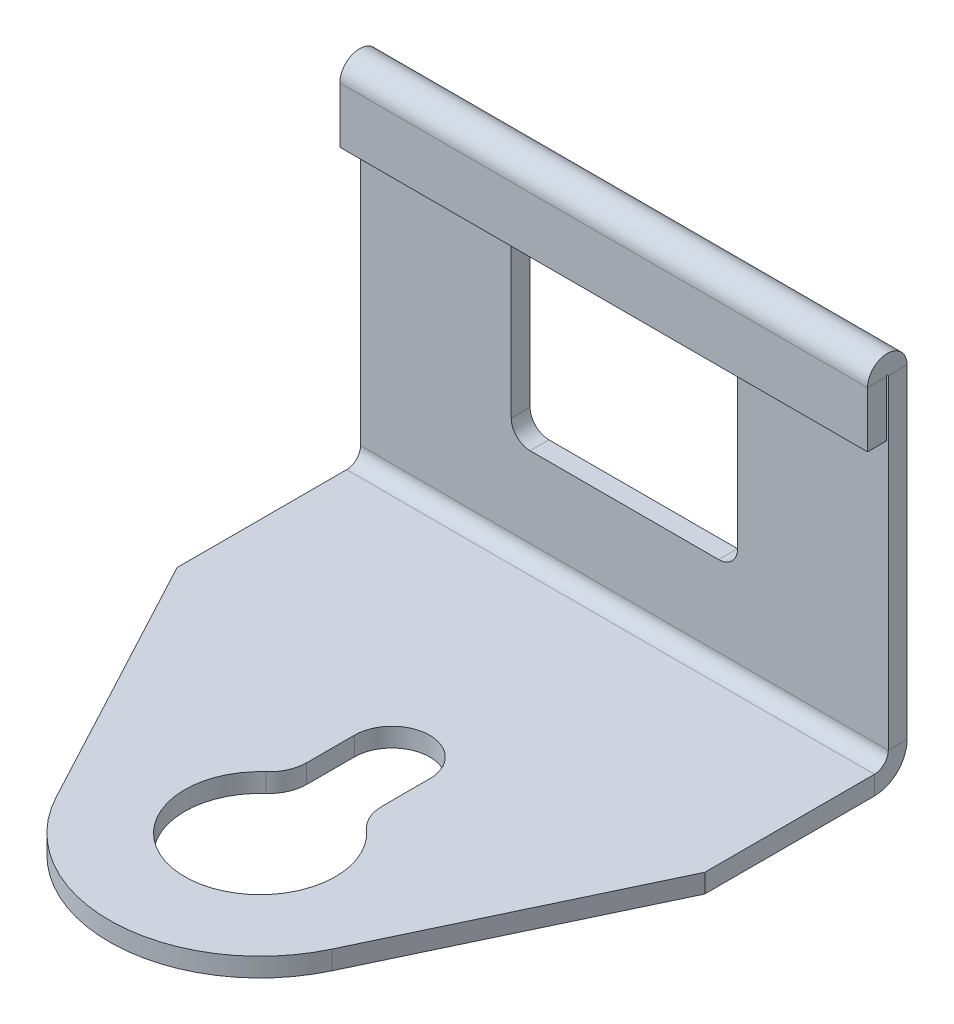
ISO-10303-21;
HEADER;
FILE_DESCRIPTION(('STEP AP214'),'2;1');
FILE_NAME('part.step','',(''),(''),'','','');
FILE_SCHEMA(('AUTOMOTIVE_DESIGN { 1 0 10303 214 1 1 1 1 }'));
ENDSEC;
DATA;
#1=APPLICATION_CONTEXT('core data for automotive mechanical design processes');
#2=APPLICATION_PROTOCOL_DEFINITION('international standard','automotive_design',2000,#1);
#3=PRODUCT_CONTEXT('',#1,'mechanical');
#4=PRODUCT('Part','Part','',(#3));
#5=PRODUCT_RELATED_PRODUCT_CATEGORY('part','',(#4));
#6=PRODUCT_DEFINITION_FORMATION('','',#4);
#7=PRODUCT_DEFINITION_CONTEXT('part definition',#1,'design');
#8=PRODUCT_DEFINITION('design','',#6,#7);
#9=PRODUCT_DEFINITION_SHAPE('','',#8);
#10=(LENGTH_UNIT() NAMED_UNIT(*) SI_UNIT(.MILLI.,.METRE.));
#11=(NAMED_UNIT(*) PLANE_ANGLE_UNIT() SI_UNIT($,.RADIAN.));
#12=(NAMED_UNIT(*) SI_UNIT($,.STERADIAN.) SOLID_ANGLE_UNIT());
#13=UNCERTAINTY_MEASURE_WITH_UNIT(LENGTH_MEASURE(1.E-05),#10,'distance_accuracy_value','');
#14=(GEOMETRIC_REPRESENTATION_CONTEXT(3) GLOBAL_UNCERTAINTY_ASSIGNED_CONTEXT((#13)) GLOBAL_UNIT_ASSIGNED_CONTEXT((#10,
#11,#12)) REPRESENTATION_CONTEXT('',''));
#15=CARTESIAN_POINT('',(0.,0.,0.));
#16=DIRECTION('',(0.,0.,1.));
#17=DIRECTION('',(1.,0.,0.));
#18=AXIS2_PLACEMENT_3D('',#15,#16,#17);
#19=CARTESIAN_POINT('',(-14.,0.,-1.7366));
#20=DIRECTION('',(-1.,0.,0.));
#21=DIRECTION('',(0.,0.,1.));
#22=AXIS2_PLACEMENT_3D('',#19,#20,#21);
#23=PLANE('',#22);
#24=DIRECTION('',(0.,1.,0.));
#25=VECTOR('',#24,1.);
#26=CARTESIAN_POINT('',(-14.,0.,-0.736599999999997));
#27=LINE('',#26,#25);
#28=CARTESIAN_POINT('',(-14.,17.95,-0.736599999999997));
#29=VERTEX_POINT('',#28);
#30=CARTESIAN_POINT('',(-14.,0.736599999999992,-0.736599999999999));
#31=VERTEX_POINT('',#30);
#32=EDGE_CURVE('E418',#29,#31,#27,.F.);
#33=ORIENTED_EDGE('',*,*,#32,.F.);
#34=DIRECTION('',(0.,0.,-1.));
#35=VECTOR('',#34,1.);
#36=CARTESIAN_POINT('',(-14.,17.95,-0.736599999999997));
#37=LINE('',#36,#35);
#38=CARTESIAN_POINT('',(-14.,17.95,-1.7366));
#39=VERTEX_POINT('',#38);
#40=EDGE_CURVE('E365',#29,#39,#37,.T.);
#41=ORIENTED_EDGE('',*,*,#40,.T.);
#42=DIRECTION('',(0.,-1.,0.));
#43=VECTOR('',#42,1.);
#44=CARTESIAN_POINT('',(-14.,0.,-1.7366));
#45=LINE('',#44,#43);
#46=CARTESIAN_POINT('',(-14.,0.736600000000004,-1.7366));
#47=VERTEX_POINT('',#46);
#48=EDGE_CURVE('E412',#39,#47,#45,.T.);
#49=ORIENTED_EDGE('',*,*,#48,.T.);
#50=DIRECTION('',(0.,0.,-1.));
#51=VECTOR('',#50,1.);
#52=CARTESIAN_POINT('',(-14.,0.736599999999997,-0.7366));
#53=LINE('',#52,#51);
#54=EDGE_CURVE('E426',#31,#47,#53,.T.);
#55=ORIENTED_EDGE('',*,*,#54,.F.);
#56=EDGE_LOOP('',(#33,#41,#49,#55));
#57=FACE_BOUND('',#56,.T.);
#58=ADVANCED_FACE('F59',(#57),#23,.T.);
#59=CARTESIAN_POINT('',(-14.,-1.,0.));
#60=DIRECTION('',(-1.,0.,0.));
#61=DIRECTION('',(0.,0.,1.));
#62=AXIS2_PLACEMENT_3D('',#59,#60,#61);
#63=PLANE('',#62);
#64=DIRECTION('',(0.,0.,1.));
#65=VECTOR('',#64,1.);
#66=CARTESIAN_POINT('',(-14.,0.,0.));
#67=LINE('',#66,#65);
#68=CARTESIAN_POINT('',(-14.,0.,0.));
#69=VERTEX_POINT('',#68);
#70=CARTESIAN_POINT('',(-14.,0.,9.));
#71=VERTEX_POINT('',#70);
#72=EDGE_CURVE('E437',#69,#71,#67,.T.);
#73=ORIENTED_EDGE('',*,*,#72,.F.);
#74=DIRECTION('',(0.,1.,0.));
#75=VECTOR('',#74,1.);
#76=CARTESIAN_POINT('',(-14.,-1.,0.));
#77=LINE('',#76,#75);
#78=CARTESIAN_POINT('',(-14.,-1.00000000000001,0.));
#79=VERTEX_POINT('',#78);
#80=EDGE_CURVE('E13',#79,#69,#77,.T.);
#81=ORIENTED_EDGE('',*,*,#80,.F.);
#82=DIRECTION('',(0.,0.,1.));
#83=VECTOR('',#82,1.);
#84=CARTESIAN_POINT('',(-14.,-1.,0.));
#85=LINE('',#84,#83);
#86=CARTESIAN_POINT('',(-14.,-1.,9.));
#87=VERTEX_POINT('',#86);
#88=EDGE_CURVE('E446',#79,#87,#85,.T.);
#89=ORIENTED_EDGE('',*,*,#88,.T.);
#90=DIRECTION('',(0.,1.,0.));
#91=VECTOR('',#90,1.);
#92=CARTESIAN_POINT('',(-14.,-1.,9.));
#93=LINE('',#92,#91);
#94=EDGE_CURVE('E63',#87,#71,#93,.T.);
#95=ORIENTED_EDGE('',*,*,#94,.T.);
#96=EDGE_LOOP('',(#73,#81,#89,#95));
#97=FACE_BOUND('',#96,.T.);
#98=ADVANCED_FACE('F61',(#97),#63,.T.);
#99=CARTESIAN_POINT('',(14.,-1.,0.));
#100=DIRECTION('',(1.,0.,0.));
#101=DIRECTION('',(0.,0.,-1.));
#102=AXIS2_PLACEMENT_3D('',#99,#100,#101);
#103=PLANE('',#102);
#104=DIRECTION('',(0.,0.,-1.));
#105=VECTOR('',#104,1.);
#106=CARTESIAN_POINT('',(14.,0.,0.));
#107=LINE('',#106,#105);
#108=CARTESIAN_POINT('',(14.,0.,9.));
#109=VERTEX_POINT('',#108);
#110=CARTESIAN_POINT('',(14.,0.,0.));
#111=VERTEX_POINT('',#110);
#112=EDGE_CURVE('E475',#109,#111,#107,.T.);
#113=ORIENTED_EDGE('',*,*,#112,.F.);
#114=DIRECTION('',(0.,1.,0.));
#115=VECTOR('',#114,1.);
#116=CARTESIAN_POINT('',(14.,-1.,9.));
#117=LINE('',#116,#115);
#118=CARTESIAN_POINT('',(14.,-1.,9.));
#119=VERTEX_POINT('',#118);
#120=EDGE_CURVE('E481',#119,#109,#117,.T.);
#121=ORIENTED_EDGE('',*,*,#120,.F.);
#122=DIRECTION('',(0.,0.,-1.));
#123=VECTOR('',#122,1.);
#124=CARTESIAN_POINT('',(14.,-1.,0.));
#125=LINE('',#124,#123);
#126=CARTESIAN_POINT('',(14.,-1.,0.));
#127=VERTEX_POINT('',#126);
#128=EDGE_CURVE('E459',#119,#127,#125,.T.);
#129=ORIENTED_EDGE('',*,*,#128,.T.);
#130=DIRECTION('',(0.,1.,0.));
#131=VECTOR('',#130,1.);
#132=CARTESIAN_POINT('',(14.,-1.,0.));
#133=LINE('',#132,#131);
#134=EDGE_CURVE('E68',#127,#111,#133,.T.);
#135=ORIENTED_EDGE('',*,*,#134,.T.);
#136=EDGE_LOOP('',(#113,#121,#129,#135));
#137=FACE_BOUND('',#136,.T.);
#138=ADVANCED_FACE('F537',(#137),#103,.T.);
#139=CARTESIAN_POINT('',(14.,-1.,9.));
#140=DIRECTION('',(0.903627273793395,0.,0.428319682079538));
#141=DIRECTION('',(0.428319682079538,0.,-0.903627273793395));
#142=AXIS2_PLACEMENT_3D('',#139,#140,#141);
#143=PLANE('',#142);
#144=DIRECTION('',(0.428319682079538,0.,-0.903627273793395));
#145=VECTOR('',#144,1.);
#146=CARTESIAN_POINT('',(14.,0.,9.));
#147=LINE('',#146,#145);
#148=CARTESIAN_POINT('',(7.63580650116148,0.,22.4265574566363));
#149=VERTEX_POINT('',#148);
#150=EDGE_CURVE('E472',#149,#109,#147,.T.);
#151=ORIENTED_EDGE('',*,*,#150,.F.);
#152=DIRECTION('',(0.,1.,0.));
#153=VECTOR('',#152,1.);
#154=CARTESIAN_POINT('',(7.63580650116148,-1.,22.4265574566363));
#155=LINE('',#154,#153);
#156=CARTESIAN_POINT('',(7.63580650116148,-1.,22.4265574566363));
#157=VERTEX_POINT('',#156);
#158=EDGE_CURVE('E483',#157,#149,#155,.T.);
#159=ORIENTED_EDGE('',*,*,#158,.F.);
#160=DIRECTION('',(0.428319682079538,0.,-0.903627273793395));
#161=VECTOR('',#160,1.);
#162=CARTESIAN_POINT('',(14.,-1.,9.));
#163=LINE('',#162,#161);
#164=EDGE_CURVE('E456',#157,#119,#163,.T.);
#165=ORIENTED_EDGE('',*,*,#164,.T.);
#166=ORIENTED_EDGE('',*,*,#120,.T.);
#167=EDGE_LOOP('',(#151,#159,#165,#166));
#168=FACE_BOUND('',#167,.T.);
#169=ADVANCED_FACE('F540',(#168),#143,.T.);
#170=CARTESIAN_POINT('',(0.406788310814313,-1.,19.));
#171=DIRECTION('',(0.,1.,0.));
#172=DIRECTION('',(0.,0.,1.));
#173=AXIS2_PLACEMENT_3D('',#170,#171,#172);
#174=CYLINDRICAL_SURFACE('',#173,8.);
#175=CARTESIAN_POINT('',(0.406788310814313,0.,19.));
#176=DIRECTION('',(0.,1.,0.));
#177=DIRECTION('',(0.,0.,1.));
#178=AXIS2_PLACEMENT_3D('',#175,#176,#177);
#179=CIRCLE('',#178,8.);
#180=CARTESIAN_POINT('',(-6.65058966208493,0.,22.7674150484963));
#181=VERTEX_POINT('',#180);
#182=EDGE_CURVE('E469',#181,#149,#179,.T.);
#183=ORIENTED_EDGE('',*,*,#182,.F.);
#184=DIRECTION('',(0.,1.,0.));
#185=VECTOR('',#184,1.);
#186=CARTESIAN_POINT('',(-6.65058966208493,-1.,22.7674150484963));
#187=LINE('',#186,#185);
#188=CARTESIAN_POINT('',(-6.65058966208493,-1.,22.7674150484963));
#189=VERTEX_POINT('',#188);
#190=EDGE_CURVE('E484',#189,#181,#187,.T.);
#191=ORIENTED_EDGE('',*,*,#190,.F.);
#192=CARTESIAN_POINT('',(0.406788310814313,-1.,19.));
#193=DIRECTION('',(0.,1.,0.));
#194=DIRECTION('',(0.,0.,1.));
#195=AXIS2_PLACEMENT_3D('',#192,#193,#194);
#196=CIRCLE('',#195,8.);
#197=EDGE_CURVE('E453',#189,#157,#196,.T.);
#198=ORIENTED_EDGE('',*,*,#197,.T.);
#199=ORIENTED_EDGE('',*,*,#158,.T.);
#200=EDGE_LOOP('',(#183,#191,#198,#199));
#201=FACE_BOUND('',#200,.T.);
#202=ADVANCED_FACE('F543',(#201),#174,.T.);
#203=CARTESIAN_POINT('',(-14.,-1.,9.));
#204=DIRECTION('',(-0.882172246612405,0.,0.470926881062041));
#205=DIRECTION('',(0.470926881062041,0.,0.882172246612406));
#206=AXIS2_PLACEMENT_3D('',#203,#204,#205);
#207=PLANE('',#206);
#208=DIRECTION('',(0.470926881062041,0.,0.882172246612405));
#209=VECTOR('',#208,1.);
#210=CARTESIAN_POINT('',(-14.,0.,9.));
#211=LINE('',#210,#209);
#212=EDGE_CURVE('E466',#71,#181,#211,.T.);
#213=ORIENTED_EDGE('',*,*,#212,.F.);
#214=ORIENTED_EDGE('',*,*,#94,.F.);
#215=DIRECTION('',(0.470926881062041,0.,0.882172246612405));
#216=VECTOR('',#215,1.);
#217=CARTESIAN_POINT('',(-14.,-1.,9.));
#218=LINE('',#217,#216);
#219=EDGE_CURVE('E449',#87,#189,#218,.T.);
#220=ORIENTED_EDGE('',*,*,#219,.T.);
#221=ORIENTED_EDGE('',*,*,#190,.T.);
#222=EDGE_LOOP('',(#213,#214,#220,#221));
#223=FACE_BOUND('',#222,.T.);
#224=ADVANCED_FACE('F491',(#223),#207,.T.);
#225=CARTESIAN_POINT('',(0.406788310814313,-1.,19.));
#226=DIRECTION('',(0.,1.,0.));
#227=DIRECTION('',(0.,0.,1.));
#228=AXIS2_PLACEMENT_3D('',#225,#226,#227);
#229=PLANE('',#228);
#230=CARTESIAN_POINT('',(0.406788310814313,-0.999999999999999,19.));
#231=DIRECTION('',(0.,1.,0.));
#232=DIRECTION('',(0.,0.,1.));
#233=AXIS2_PLACEMENT_3D('',#230,#231,#232);
#234=CIRCLE('',#233,4.);
#235=CARTESIAN_POINT('',(-2.25987835585235,-0.999999999999999,16.0185760300003));
#236=VERTEX_POINT('',#235);
#237=CARTESIAN_POINT('',(3.07345497748098,-0.999999999999999,16.0185760300003));
#238=VERTEX_POINT('',#237);
#239=EDGE_CURVE('E294',#236,#238,#234,.T.);
#240=ORIENTED_EDGE('',*,*,#239,.T.);
#241=CARTESIAN_POINT('',(4.40678831081431,-0.999999999999999,14.5278640450004));
#242=DIRECTION('',(0.,1.,0.));
#243=DIRECTION('',(0.,0.,1.));
#244=AXIS2_PLACEMENT_3D('',#241,#242,#243);
#245=CIRCLE('',#244,2.);
#246=CARTESIAN_POINT('',(2.40678831081431,-0.999999999999999,14.5278640450004));
#247=VERTEX_POINT('',#246);
#248=EDGE_CURVE('E297',#238,#247,#245,.F.);
#249=ORIENTED_EDGE('',*,*,#248,.T.);
#250=DIRECTION('',(0.,0.,-1.));
#251=VECTOR('',#250,1.);
#252=CARTESIAN_POINT('',(2.40678831081431,-1.,19.));
#253=LINE('',#252,#251);
#254=CARTESIAN_POINT('',(2.40678831081431,-1.,12.));
#255=VERTEX_POINT('',#254);
#256=EDGE_CURVE('E279',#247,#255,#253,.T.);
#257=ORIENTED_EDGE('',*,*,#256,.T.);
#258=CARTESIAN_POINT('',(0.406788310814314,-0.999999999999999,12.));
#259=DIRECTION('',(0.,1.,0.));
#260=DIRECTION('',(0.,0.,1.));
#261=AXIS2_PLACEMENT_3D('',#258,#259,#260);
#262=CIRCLE('',#261,2.);
#263=CARTESIAN_POINT('',(-1.59321168918569,-0.999999999999999,12.));
#264=VERTEX_POINT('',#263);
#265=EDGE_CURVE('E252',#255,#264,#262,.T.);
#266=ORIENTED_EDGE('',*,*,#265,.T.);
#267=DIRECTION('',(0.,0.,1.));
#268=VECTOR('',#267,1.);
#269=CARTESIAN_POINT('',(-1.59321168918569,-1.,19.));
#270=LINE('',#269,#268);
#271=CARTESIAN_POINT('',(-1.59321168918569,-0.999999999999999,14.5278640450004));
#272=VERTEX_POINT('',#271);
#273=EDGE_CURVE('E288',#264,#272,#270,.T.);
#274=ORIENTED_EDGE('',*,*,#273,.T.);
#275=CARTESIAN_POINT('',(-3.59321168918569,-0.999999999999999,14.5278640450004));
#276=DIRECTION('',(0.,1.,0.));
#277=DIRECTION('',(0.,0.,1.));
#278=AXIS2_PLACEMENT_3D('',#275,#276,#277);
#279=CIRCLE('',#278,2.);
#280=EDGE_CURVE('E291',#272,#236,#279,.F.);
#281=ORIENTED_EDGE('',*,*,#280,.T.);
#282=EDGE_LOOP('',(#240,#249,#257,#266,#274,#281));
#283=FACE_BOUND('',#282,.T.);
#284=ORIENTED_EDGE('',*,*,#88,.F.);
#285=DIRECTION('',(-1.,0.,0.));
#286=VECTOR('',#285,1.);
#287=CARTESIAN_POINT('',(-14.,-1.,0.));
#288=LINE('',#287,#286);
#289=EDGE_CURVE('E461',#127,#79,#288,.T.);
#290=ORIENTED_EDGE('',*,*,#289,.F.);
#291=ORIENTED_EDGE('',*,*,#128,.F.);
#292=ORIENTED_EDGE('',*,*,#164,.F.);
#293=ORIENTED_EDGE('',*,*,#197,.F.);
#294=ORIENTED_EDGE('',*,*,#219,.F.);
#295=EDGE_LOOP('',(#284,#290,#291,#292,#293,#294));
#296=FACE_BOUND('',#295,.T.);
#297=ADVANCED_FACE('F532',(#283,#296),#229,.F.);
#298=CARTESIAN_POINT('',(0.406788310814313,0.,19.));
#299=DIRECTION('',(0.,1.,0.));
#300=DIRECTION('',(0.,0.,1.));
#301=AXIS2_PLACEMENT_3D('',#298,#299,#300);
#302=PLANE('',#301);
#303=CARTESIAN_POINT('',(4.40678831081431,0.,14.5278640450004));
#304=DIRECTION('',(0.,-1.,0.));
#305=DIRECTION('',(0.,0.,1.));
#306=AXIS2_PLACEMENT_3D('',#303,#304,#305);
#307=CIRCLE('',#306,2.);
#308=CARTESIAN_POINT('',(3.07345497748098,0.,16.0185760300003));
#309=VERTEX_POINT('',#308);
#310=CARTESIAN_POINT('',(2.40678831081431,0.,14.5278640450004));
#311=VERTEX_POINT('',#310);
#312=EDGE_CURVE('E84',#309,#311,#307,.T.);
#313=ORIENTED_EDGE('',*,*,#312,.F.);
#314=CARTESIAN_POINT('',(0.406788310814313,0.,19.));
#315=DIRECTION('',(0.,1.,0.));
#316=DIRECTION('',(0.,0.,1.));
#317=AXIS2_PLACEMENT_3D('',#314,#315,#316);
#318=CIRCLE('',#317,4.);
#319=CARTESIAN_POINT('',(-2.25987835585235,0.,16.0185760300003));
#320=VERTEX_POINT('',#319);
#321=EDGE_CURVE('E274',#320,#309,#318,.T.);
#322=ORIENTED_EDGE('',*,*,#321,.F.);
#323=CARTESIAN_POINT('',(-3.59321168918569,0.,14.5278640450004));
#324=DIRECTION('',(0.,-1.,0.));
#325=DIRECTION('',(0.,0.,-1.));
#326=AXIS2_PLACEMENT_3D('',#323,#324,#325);
#327=CIRCLE('',#326,2.);
#328=CARTESIAN_POINT('',(-1.59321168918569,0.,14.5278640450004));
#329=VERTEX_POINT('',#328);
#330=EDGE_CURVE('E268',#329,#320,#327,.T.);
#331=ORIENTED_EDGE('',*,*,#330,.F.);
#332=DIRECTION('',(0.,0.,1.));
#333=VECTOR('',#332,1.);
#334=CARTESIAN_POINT('',(-1.59321168918569,0.,12.));
#335=LINE('',#334,#333);
#336=CARTESIAN_POINT('',(-1.59321168918569,0.,12.));
#337=VERTEX_POINT('',#336);
#338=EDGE_CURVE('E266',#337,#329,#335,.T.);
#339=ORIENTED_EDGE('',*,*,#338,.F.);
#340=CARTESIAN_POINT('',(0.406788310814314,0.,12.));
#341=DIRECTION('',(0.,1.,0.));
#342=DIRECTION('',(0.,0.,1.));
#343=AXIS2_PLACEMENT_3D('',#340,#341,#342);
#344=CIRCLE('',#343,2.);
#345=CARTESIAN_POINT('',(2.40678831081431,0.,12.));
#346=VERTEX_POINT('',#345);
#347=EDGE_CURVE('E249',#346,#337,#344,.T.);
#348=ORIENTED_EDGE('',*,*,#347,.F.);
#349=DIRECTION('',(0.,0.,-1.));
#350=VECTOR('',#349,1.);
#351=CARTESIAN_POINT('',(2.40678831081431,0.,12.));
#352=LINE('',#351,#350);
#353=EDGE_CURVE('E258',#311,#346,#352,.T.);
#354=ORIENTED_EDGE('',*,*,#353,.F.);
#355=EDGE_LOOP('',(#313,#322,#331,#339,#348,#354));
#356=FACE_BOUND('',#355,.T.);
#357=ORIENTED_EDGE('',*,*,#72,.T.);
#358=ORIENTED_EDGE('',*,*,#212,.T.);
#359=ORIENTED_EDGE('',*,*,#182,.T.);
#360=ORIENTED_EDGE('',*,*,#150,.T.);
#361=ORIENTED_EDGE('',*,*,#112,.T.);
#362=DIRECTION('',(-1.,0.,0.));
#363=VECTOR('',#362,1.);
#364=CARTESIAN_POINT('',(-14.,0.,0.));
#365=LINE('',#364,#363);
#366=EDGE_CURVE('E450',#111,#69,#365,.T.);
#367=ORIENTED_EDGE('',*,*,#366,.T.);
#368=EDGE_LOOP('',(#357,#358,#359,#360,#361,#367));
#369=FACE_BOUND('',#368,.T.);
#370=ADVANCED_FACE('F262',(#356,#369),#302,.T.);
#371=CARTESIAN_POINT('',(14.,0.736599999999992,0.));
#372=DIRECTION('',(1.,0.,0.));
#373=DIRECTION('',(0.,0.,-1.));
#374=AXIS2_PLACEMENT_3D('',#371,#372,#373);
#375=PLANE('',#374);
#376=DIRECTION('',(0.,0.,-1.));
#377=VECTOR('',#376,1.);
#378=CARTESIAN_POINT('',(14.,0.736600000000004,-1.73660000000012));
#379=LINE('',#378,#377);
#380=CARTESIAN_POINT('',(14.,0.736599999999992,-0.736599999999997));
#381=VERTEX_POINT('',#380);
#382=CARTESIAN_POINT('',(14.,0.736599999999992,-1.7366));
#383=VERTEX_POINT('',#382);
#384=EDGE_CURVE('E410',#381,#383,#379,.T.);
#385=ORIENTED_EDGE('',*,*,#384,.F.);
#386=CARTESIAN_POINT('',(14.,0.736599999999992,0.));
#387=DIRECTION('',(-1.,0.,0.));
#388=DIRECTION('',(0.,0.,1.));
#389=AXIS2_PLACEMENT_3D('',#386,#387,#388);
#390=CIRCLE('',#389,0.736599999999998);
#391=EDGE_CURVE('E441',#111,#381,#390,.F.);
#392=ORIENTED_EDGE('',*,*,#391,.F.);
#393=ORIENTED_EDGE('',*,*,#134,.F.);
#394=CARTESIAN_POINT('',(14.,0.736599999999992,0.));
#395=DIRECTION('',(-1.,0.,0.));
#396=DIRECTION('',(0.,0.,1.));
#397=AXIS2_PLACEMENT_3D('',#394,#395,#396);
#398=CIRCLE('',#397,1.7366);
#399=EDGE_CURVE('E434',#127,#383,#398,.F.);
#400=ORIENTED_EDGE('',*,*,#399,.T.);
#401=EDGE_LOOP('',(#385,#392,#393,#400));
#402=FACE_BOUND('',#401,.T.);
#403=ADVANCED_FACE('F535',(#402),#375,.T.);
#404=CARTESIAN_POINT('',(-14.,0.736599999999992,0.));
#405=DIRECTION('',(1.,0.,0.));
#406=DIRECTION('',(0.,0.,-1.));
#407=AXIS2_PLACEMENT_3D('',#404,#405,#406);
#408=PLANE('',#407);
#409=CARTESIAN_POINT('',(-14.,0.736599999999992,0.));
#410=DIRECTION('',(-1.,0.,0.));
#411=DIRECTION('',(0.,0.,1.));
#412=AXIS2_PLACEMENT_3D('',#409,#410,#411);
#413=CIRCLE('',#412,0.736599999999998);
#414=EDGE_CURVE('E414',#31,#69,#413,.T.);
#415=ORIENTED_EDGE('',*,*,#414,.F.);
#416=ORIENTED_EDGE('',*,*,#54,.T.);
#417=CARTESIAN_POINT('',(-14.,0.736599999999992,0.));
#418=DIRECTION('',(-1.,0.,0.));
#419=DIRECTION('',(0.,0.,1.));
#420=AXIS2_PLACEMENT_3D('',#417,#418,#419);
#421=CIRCLE('',#420,1.7366);
#422=EDGE_CURVE('E438',#47,#79,#421,.T.);
#423=ORIENTED_EDGE('',*,*,#422,.T.);
#424=ORIENTED_EDGE('',*,*,#80,.T.);
#425=EDGE_LOOP('',(#415,#416,#423,#424));
#426=FACE_BOUND('',#425,.T.);
#427=ADVANCED_FACE('F498',(#426),#408,.F.);
#428=CARTESIAN_POINT('',(-14.,0.736599999999992,0.));
#429=DIRECTION('',(-1.,0.,0.));
#430=DIRECTION('',(0.,0.,-1.));
#431=AXIS2_PLACEMENT_3D('',#428,#429,#430);
#432=CYLINDRICAL_SURFACE('',#431,1.7366);
#433=ORIENTED_EDGE('',*,*,#289,.T.);
#434=ORIENTED_EDGE('',*,*,#422,.F.);
#435=DIRECTION('',(-1.,0.,0.));
#436=VECTOR('',#435,1.);
#437=CARTESIAN_POINT('',(0.,0.736600000000004,-1.7366));
#438=LINE('',#437,#436);
#439=EDGE_CURVE('E423',#383,#47,#438,.T.);
#440=ORIENTED_EDGE('',*,*,#439,.F.);
#441=ORIENTED_EDGE('',*,*,#399,.F.);
#442=EDGE_LOOP('',(#433,#434,#440,#441));
#443=FACE_BOUND('',#442,.T.);
#444=ADVANCED_FACE('F526',(#443),#432,.T.);
#445=CARTESIAN_POINT('',(-14.,0.736599999999992,0.));
#446=DIRECTION('',(-1.,0.,0.));
#447=DIRECTION('',(0.,0.,-1.));
#448=AXIS2_PLACEMENT_3D('',#445,#446,#447);
#449=CYLINDRICAL_SURFACE('',#448,0.736599999999998);
#450=ORIENTED_EDGE('',*,*,#366,.F.);
#451=ORIENTED_EDGE('',*,*,#391,.T.);
#452=DIRECTION('',(1.,0.,0.));
#453=VECTOR('',#452,1.);
#454=CARTESIAN_POINT('',(14.,0.736599999999997,-0.736599999999997));
#455=LINE('',#454,#453);
#456=EDGE_CURVE('E429',#381,#31,#455,.F.);
#457=ORIENTED_EDGE('',*,*,#456,.T.);
#458=ORIENTED_EDGE('',*,*,#414,.T.);
#459=EDGE_LOOP('',(#450,#451,#457,#458));
#460=FACE_BOUND('',#459,.T.);
#461=ADVANCED_FACE('F501',(#460),#449,.F.);
#462=CARTESIAN_POINT('',(14.,19.,-1.7366));
#463=DIRECTION('',(1.,0.,0.));
#464=DIRECTION('',(0.,0.,-1.));
#465=AXIS2_PLACEMENT_3D('',#462,#463,#464);
#466=PLANE('',#465);
#467=DIRECTION('',(0.,0.,-1.));
#468=VECTOR('',#467,1.);
#469=CARTESIAN_POINT('',(14.,17.95,-0.736599999999997));
#470=LINE('',#469,#468);
#471=CARTESIAN_POINT('',(14.,17.95,-0.736599999999997));
#472=VERTEX_POINT('',#471);
#473=CARTESIAN_POINT('',(14.,17.95,-1.7366));
#474=VERTEX_POINT('',#473);
#475=EDGE_CURVE('E374',#472,#474,#470,.T.);
#476=ORIENTED_EDGE('',*,*,#475,.F.);
#477=DIRECTION('',(0.,-1.,0.));
#478=VECTOR('',#477,1.);
#479=CARTESIAN_POINT('',(14.,0.,-0.736599999999997));
#480=LINE('',#479,#478);
#481=EDGE_CURVE('E420',#381,#472,#480,.F.);
#482=ORIENTED_EDGE('',*,*,#481,.F.);
#483=ORIENTED_EDGE('',*,*,#384,.T.);
#484=DIRECTION('',(0.,1.,0.));
#485=VECTOR('',#484,1.);
#486=CARTESIAN_POINT('',(14.,19.,-1.7366));
#487=LINE('',#486,#485);
#488=EDGE_CURVE('E415',#383,#474,#487,.T.);
#489=ORIENTED_EDGE('',*,*,#488,.T.);
#490=EDGE_LOOP('',(#476,#482,#483,#489));
#491=FACE_BOUND('',#490,.T.);
#492=ADVANCED_FACE('F510',(#491),#466,.T.);
#493=CARTESIAN_POINT('',(0.,0.,-1.7366));
#494=DIRECTION('',(0.,0.,-1.));
#495=DIRECTION('',(-1.,0.,0.));
#496=AXIS2_PLACEMENT_3D('',#493,#494,#495);
#497=PLANE('',#496);
#498=CARTESIAN_POINT('',(5.00409033535975,6.,-1.7366));
#499=DIRECTION('',(0.,0.,-1.));
#500=DIRECTION('',(-1.,0.,0.));
#501=AXIS2_PLACEMENT_3D('',#498,#499,#500);
#502=CIRCLE('',#501,0.999999999999997);
#503=CARTESIAN_POINT('',(6.00409033535975,6.,-1.7366));
#504=VERTEX_POINT('',#503);
#505=CARTESIAN_POINT('',(5.00409033535975,5.00000000000001,-1.7366));
#506=VERTEX_POINT('',#505);
#507=EDGE_CURVE('E355',#504,#506,#502,.T.);
#508=ORIENTED_EDGE('',*,*,#507,.F.);
#509=DIRECTION('',(0.,-1.,0.));
#510=VECTOR('',#509,1.);
#511=CARTESIAN_POINT('',(6.00409033535975,0.,-1.7366));
#512=LINE('',#511,#510);
#513=CARTESIAN_POINT('',(6.00409033535975,14.0571176454546,-1.7366));
#514=VERTEX_POINT('',#513);
#515=EDGE_CURVE('E326',#514,#504,#512,.T.);
#516=ORIENTED_EDGE('',*,*,#515,.F.);
#517=CARTESIAN_POINT('',(5.00409033535975,14.0571176454546,-1.7366));
#518=DIRECTION('',(0.,0.,-1.));
#519=DIRECTION('',(-1.,0.,0.));
#520=AXIS2_PLACEMENT_3D('',#517,#518,#519);
#521=CIRCLE('',#520,0.999999999999999);
#522=CARTESIAN_POINT('',(5.00409033535975,15.0571176454546,-1.7366));
#523=VERTEX_POINT('',#522);
#524=EDGE_CURVE('E342',#523,#514,#521,.T.);
#525=ORIENTED_EDGE('',*,*,#524,.F.);
#526=DIRECTION('',(1.,0.,0.));
#527=VECTOR('',#526,1.);
#528=CARTESIAN_POINT('',(0.,15.0571176454546,-1.7366));
#529=LINE('',#528,#527);
#530=CARTESIAN_POINT('',(-5.00409033535975,15.0571176454546,-1.7366));
#531=VERTEX_POINT('',#530);
#532=EDGE_CURVE('E345',#531,#523,#529,.T.);
#533=ORIENTED_EDGE('',*,*,#532,.F.);
#534=CARTESIAN_POINT('',(-5.00409033535975,14.0571176454546,-1.7366));
#535=DIRECTION('',(0.,0.,-1.));
#536=DIRECTION('',(-1.,0.,0.));
#537=AXIS2_PLACEMENT_3D('',#534,#535,#536);
#538=CIRCLE('',#537,1.);
#539=CARTESIAN_POINT('',(-6.00409033535975,14.0571176454546,-1.7366));
#540=VERTEX_POINT('',#539);
#541=EDGE_CURVE('E347',#540,#531,#538,.T.);
#542=ORIENTED_EDGE('',*,*,#541,.F.);
#543=DIRECTION('',(0.,1.,0.));
#544=VECTOR('',#543,1.);
#545=CARTESIAN_POINT('',(-6.00409033535975,0.,-1.7366));
#546=LINE('',#545,#544);
#547=CARTESIAN_POINT('',(-6.00409033535975,6.,-1.7366));
#548=VERTEX_POINT('',#547);
#549=EDGE_CURVE('E349',#548,#540,#546,.T.);
#550=ORIENTED_EDGE('',*,*,#549,.F.);
#551=CARTESIAN_POINT('',(-5.00409033535975,6.,-1.7366));
#552=DIRECTION('',(0.,0.,-1.));
#553=DIRECTION('',(-1.,0.,0.));
#554=AXIS2_PLACEMENT_3D('',#551,#552,#553);
#555=CIRCLE('',#554,1.);
#556=CARTESIAN_POINT('',(-5.00409033535975,5.,-1.7366));
#557=VERTEX_POINT('',#556);
#558=EDGE_CURVE('E351',#557,#548,#555,.T.);
#559=ORIENTED_EDGE('',*,*,#558,.F.);
#560=DIRECTION('',(-1.,0.,0.));
#561=VECTOR('',#560,1.);
#562=CARTESIAN_POINT('',(0.,5.,-1.7366));
#563=LINE('',#562,#561);
#564=EDGE_CURVE('E353',#506,#557,#563,.T.);
#565=ORIENTED_EDGE('',*,*,#564,.F.);
#566=EDGE_LOOP('',(#508,#516,#525,#533,#542,#550,#559,#565));
#567=FACE_BOUND('',#566,.T.);
#568=DIRECTION('',(-1.,0.,0.));
#569=VECTOR('',#568,1.);
#570=CARTESIAN_POINT('',(-14.,17.95,-1.7366));
#571=LINE('',#570,#569);
#572=EDGE_CURVE('E358',#39,#474,#571,.F.);
#573=ORIENTED_EDGE('',*,*,#572,.T.);
#574=ORIENTED_EDGE('',*,*,#488,.F.);
#575=ORIENTED_EDGE('',*,*,#439,.T.);
#576=ORIENTED_EDGE('',*,*,#48,.F.);
#577=EDGE_LOOP('',(#573,#574,#575,#576));
#578=FACE_BOUND('',#577,.T.);
#579=ADVANCED_FACE('F522',(#567,#578),#497,.T.);
#580=CARTESIAN_POINT('',(0.,0.,-0.736599999999997));
#581=DIRECTION('',(0.,0.,-1.));
#582=DIRECTION('',(-1.,0.,0.));
#583=AXIS2_PLACEMENT_3D('',#580,#581,#582);
#584=PLANE('',#583);
#585=DIRECTION('',(0.,1.,0.));
#586=VECTOR('',#585,1.);
#587=CARTESIAN_POINT('',(6.00409033535975,14.0571176454546,-0.736599999999997));
#588=LINE('',#587,#586);
#589=CARTESIAN_POINT('',(6.00409033535975,6.,-0.736599999999997));
#590=VERTEX_POINT('',#589);
#591=CARTESIAN_POINT('',(6.00409033535975,14.0571176454546,-0.736599999999997));
#592=VERTEX_POINT('',#591);
#593=EDGE_CURVE('E302',#590,#592,#588,.T.);
#594=ORIENTED_EDGE('',*,*,#593,.F.);
#595=CARTESIAN_POINT('',(5.00409033535975,6.,-0.736599999999997));
#596=DIRECTION('',(0.,0.,1.));
#597=DIRECTION('',(-1.,0.,0.));
#598=AXIS2_PLACEMENT_3D('',#595,#596,#597);
#599=CIRCLE('',#598,0.999999999999997);
#600=CARTESIAN_POINT('',(5.00409033535975,5.00000000000001,-0.736599999999997));
#601=VERTEX_POINT('',#600);
#602=EDGE_CURVE('E300',#601,#590,#599,.T.);
#603=ORIENTED_EDGE('',*,*,#602,.F.);
#604=DIRECTION('',(1.,0.,0.));
#605=VECTOR('',#604,1.);
#606=CARTESIAN_POINT('',(-5.00409033535975,5.,-0.736599999999997));
#607=LINE('',#606,#605);
#608=CARTESIAN_POINT('',(-5.00409033535975,5.,-0.736599999999997));
#609=VERTEX_POINT('',#608);
#610=EDGE_CURVE('E320',#609,#601,#607,.T.);
#611=ORIENTED_EDGE('',*,*,#610,.F.);
#612=CARTESIAN_POINT('',(-5.00409033535975,6.,-0.736599999999997));
#613=DIRECTION('',(0.,0.,1.));
#614=DIRECTION('',(1.,0.,0.));
#615=AXIS2_PLACEMENT_3D('',#612,#613,#614);
#616=CIRCLE('',#615,1.);
#617=CARTESIAN_POINT('',(-6.00409033535975,6.,-0.736599999999997));
#618=VERTEX_POINT('',#617);
#619=EDGE_CURVE('E317',#618,#609,#616,.T.);
#620=ORIENTED_EDGE('',*,*,#619,.F.);
#621=DIRECTION('',(0.,-1.,0.));
#622=VECTOR('',#621,1.);
#623=CARTESIAN_POINT('',(-6.00409033535975,14.0571176454546,-0.736599999999997));
#624=LINE('',#623,#622);
#625=CARTESIAN_POINT('',(-6.00409033535975,14.0571176454546,-0.736599999999997));
#626=VERTEX_POINT('',#625);
#627=EDGE_CURVE('E314',#626,#618,#624,.T.);
#628=ORIENTED_EDGE('',*,*,#627,.F.);
#629=CARTESIAN_POINT('',(-5.00409033535975,14.0571176454546,-0.736599999999997));
#630=DIRECTION('',(0.,0.,1.));
#631=DIRECTION('',(-1.,0.,0.));
#632=AXIS2_PLACEMENT_3D('',#629,#630,#631);
#633=CIRCLE('',#632,1.);
#634=CARTESIAN_POINT('',(-5.00409033535975,15.0571176454546,-0.736599999999997));
#635=VERTEX_POINT('',#634);
#636=EDGE_CURVE('E311',#635,#626,#633,.T.);
#637=ORIENTED_EDGE('',*,*,#636,.F.);
#638=DIRECTION('',(-1.,0.,0.));
#639=VECTOR('',#638,1.);
#640=CARTESIAN_POINT('',(-5.00409033535975,15.0571176454546,-0.736599999999997));
#641=LINE('',#640,#639);
#642=CARTESIAN_POINT('',(5.00409033535975,15.0571176454546,-0.736599999999997));
#643=VERTEX_POINT('',#642);
#644=EDGE_CURVE('E308',#643,#635,#641,.T.);
#645=ORIENTED_EDGE('',*,*,#644,.F.);
#646=CARTESIAN_POINT('',(5.00409033535975,14.0571176454546,-0.736599999999997));
#647=DIRECTION('',(0.,0.,1.));
#648=DIRECTION('',(1.,0.,0.));
#649=AXIS2_PLACEMENT_3D('',#646,#647,#648);
#650=CIRCLE('',#649,0.999999999999999);
#651=EDGE_CURVE('E305',#592,#643,#650,.T.);
#652=ORIENTED_EDGE('',*,*,#651,.F.);
#653=EDGE_LOOP('',(#594,#603,#611,#620,#628,#637,#645,#652));
#654=FACE_BOUND('',#653,.T.);
#655=ORIENTED_EDGE('',*,*,#481,.T.);
#656=DIRECTION('',(-1.,0.,0.));
#657=VECTOR('',#656,1.);
#658=CARTESIAN_POINT('',(-14.,17.95,-0.736599999999997));
#659=LINE('',#658,#657);
#660=EDGE_CURVE('E371',#29,#472,#659,.F.);
#661=ORIENTED_EDGE('',*,*,#660,.F.);
#662=ORIENTED_EDGE('',*,*,#32,.T.);
#663=ORIENTED_EDGE('',*,*,#456,.F.);
#664=EDGE_LOOP('',(#655,#661,#662,#663));
#665=FACE_BOUND('',#664,.T.);
#666=ADVANCED_FACE('F505',(#654,#665),#584,.F.);
#667=CARTESIAN_POINT('',(-14.,16.475,0.363400000000003));
#668=DIRECTION('',(1.,0.,0.));
#669=DIRECTION('',(0.,1.,0.));
#670=AXIS2_PLACEMENT_3D('',#667,#668,#669);
#671=PLANE('',#670);
#672=DIRECTION('',(0.,0.,1.));
#673=VECTOR('',#672,1.);
#674=CARTESIAN_POINT('',(-14.,17.95,0.363400000000003));
#675=LINE('',#674,#673);
#676=CARTESIAN_POINT('',(-14.,17.95,-0.636599999999997));
#677=VERTEX_POINT('',#676);
#678=CARTESIAN_POINT('',(-14.,17.95,0.363400000000003));
#679=VERTEX_POINT('',#678);
#680=EDGE_CURVE('E404',#677,#679,#675,.T.);
#681=ORIENTED_EDGE('',*,*,#680,.F.);
#682=DIRECTION('',(0.,1.,0.));
#683=VECTOR('',#682,1.);
#684=CARTESIAN_POINT('',(-14.,16.475,-0.636599999999997));
#685=LINE('',#684,#683);
#686=CARTESIAN_POINT('',(-14.,15.,-0.636599999999997));
#687=VERTEX_POINT('',#686);
#688=EDGE_CURVE('E395',#687,#677,#685,.T.);
#689=ORIENTED_EDGE('',*,*,#688,.F.);
#690=DIRECTION('',(0.,0.,1.));
#691=VECTOR('',#690,1.);
#692=CARTESIAN_POINT('',(-14.,15.,0.363400000000003));
#693=LINE('',#692,#691);
#694=CARTESIAN_POINT('',(-14.,15.,0.363400000000003));
#695=VERTEX_POINT('',#694);
#696=EDGE_CURVE('E402',#687,#695,#693,.T.);
#697=ORIENTED_EDGE('',*,*,#696,.T.);
#698=DIRECTION('',(0.,1.,0.));
#699=VECTOR('',#698,1.);
#700=CARTESIAN_POINT('',(-14.,16.475,0.363400000000003));
#701=LINE('',#700,#699);
#702=EDGE_CURVE('E383',#695,#679,#701,.T.);
#703=ORIENTED_EDGE('',*,*,#702,.T.);
#704=EDGE_LOOP('',(#681,#689,#697,#703));
#705=FACE_BOUND('',#704,.T.);
#706=ADVANCED_FACE('F694',(#705),#671,.F.);
#707=CARTESIAN_POINT('',(0.,15.,0.363400000000003));
#708=DIRECTION('',(0.,1.,0.));
#709=DIRECTION('',(-1.,0.,0.));
#710=AXIS2_PLACEMENT_3D('',#707,#708,#709);
#711=PLANE('',#710);
#712=ORIENTED_EDGE('',*,*,#696,.F.);
#713=DIRECTION('',(1.,0.,0.));
#714=VECTOR('',#713,1.);
#715=CARTESIAN_POINT('',(0.,15.,-0.636599999999997));
#716=LINE('',#715,#714);
#717=CARTESIAN_POINT('',(14.,15.,-0.636599999999997));
#718=VERTEX_POINT('',#717);
#719=EDGE_CURVE('E392',#718,#687,#716,.F.);
#720=ORIENTED_EDGE('',*,*,#719,.F.);
#721=DIRECTION('',(0.,0.,1.));
#722=VECTOR('',#721,1.);
#723=CARTESIAN_POINT('',(14.,15.,0.363400000000003));
#724=LINE('',#723,#722);
#725=CARTESIAN_POINT('',(14.,15.,0.363400000000003));
#726=VERTEX_POINT('',#725);
#727=EDGE_CURVE('E382',#718,#726,#724,.T.);
#728=ORIENTED_EDGE('',*,*,#727,.T.);
#729=DIRECTION('',(-1.,0.,0.));
#730=VECTOR('',#729,1.);
#731=CARTESIAN_POINT('',(0.,15.,0.363400000000003));
#732=LINE('',#731,#730);
#733=EDGE_CURVE('E379',#726,#695,#732,.T.);
#734=ORIENTED_EDGE('',*,*,#733,.T.);
#735=EDGE_LOOP('',(#712,#720,#728,#734));
#736=FACE_BOUND('',#735,.T.);
#737=ADVANCED_FACE('F712',(#736),#711,.F.);
#738=CARTESIAN_POINT('',(14.,16.475,0.363400000000003));
#739=DIRECTION('',(-1.,0.,0.));
#740=DIRECTION('',(0.,-1.,0.));
#741=AXIS2_PLACEMENT_3D('',#738,#739,#740);
#742=PLANE('',#741);
#743=DIRECTION('',(0.,1.,0.));
#744=VECTOR('',#743,1.);
#745=CARTESIAN_POINT('',(14.,16.475,-0.636599999999997));
#746=LINE('',#745,#744);
#747=CARTESIAN_POINT('',(14.,17.95,-0.636599999999997));
#748=VERTEX_POINT('',#747);
#749=EDGE_CURVE('E376',#748,#718,#746,.F.);
#750=ORIENTED_EDGE('',*,*,#749,.F.);
#751=DIRECTION('',(0.,0.,1.));
#752=VECTOR('',#751,1.);
#753=CARTESIAN_POINT('',(14.,17.95,0.363400000000003));
#754=LINE('',#753,#752);
#755=CARTESIAN_POINT('',(14.,17.95,0.363400000000003));
#756=VERTEX_POINT('',#755);
#757=EDGE_CURVE('E407',#748,#756,#754,.T.);
#758=ORIENTED_EDGE('',*,*,#757,.T.);
#759=DIRECTION('',(0.,-1.,0.));
#760=VECTOR('',#759,1.);
#761=CARTESIAN_POINT('',(14.,16.475,0.363400000000003));
#762=LINE('',#761,#760);
#763=EDGE_CURVE('E389',#756,#726,#762,.T.);
#764=ORIENTED_EDGE('',*,*,#763,.T.);
#765=ORIENTED_EDGE('',*,*,#727,.F.);
#766=EDGE_LOOP('',(#750,#758,#764,#765));
#767=FACE_BOUND('',#766,.T.);
#768=ADVANCED_FACE('F724',(#767),#742,.F.);
#769=CARTESIAN_POINT('',(0.,16.475,0.363400000000003));
#770=DIRECTION('',(0.,0.,1.));
#771=DIRECTION('',(1.,0.,0.));
#772=AXIS2_PLACEMENT_3D('',#769,#770,#771);
#773=PLANE('',#772);
#774=ORIENTED_EDGE('',*,*,#733,.F.);
#775=ORIENTED_EDGE('',*,*,#763,.F.);
#776=DIRECTION('',(1.,0.,0.));
#777=VECTOR('',#776,1.);
#778=CARTESIAN_POINT('',(0.,17.95,0.363400000000003));
#779=LINE('',#778,#777);
#780=EDGE_CURVE('E386',#679,#756,#779,.T.);
#781=ORIENTED_EDGE('',*,*,#780,.F.);
#782=ORIENTED_EDGE('',*,*,#702,.F.);
#783=EDGE_LOOP('',(#774,#775,#781,#782));
#784=FACE_BOUND('',#783,.T.);
#785=ADVANCED_FACE('F736',(#784),#773,.T.);
#786=CARTESIAN_POINT('',(0.,16.475,-0.636599999999997));
#787=DIRECTION('',(0.,0.,1.));
#788=DIRECTION('',(1.,0.,0.));
#789=AXIS2_PLACEMENT_3D('',#786,#787,#788);
#790=PLANE('',#789);
#791=ORIENTED_EDGE('',*,*,#719,.T.);
#792=ORIENTED_EDGE('',*,*,#688,.T.);
#793=DIRECTION('',(1.,0.,0.));
#794=VECTOR('',#793,1.);
#795=CARTESIAN_POINT('',(0.,17.95,-0.636599999999997));
#796=LINE('',#795,#794);
#797=EDGE_CURVE('E398',#677,#748,#796,.T.);
#798=ORIENTED_EDGE('',*,*,#797,.T.);
#799=ORIENTED_EDGE('',*,*,#749,.T.);
#800=EDGE_LOOP('',(#791,#792,#798,#799));
#801=FACE_BOUND('',#800,.T.);
#802=ADVANCED_FACE('F748',(#801),#790,.F.);
#803=CARTESIAN_POINT('',(14.,17.95,-0.686599999999997));
#804=DIRECTION('',(1.,0.,0.));
#805=DIRECTION('',(0.,0.,-1.));
#806=AXIS2_PLACEMENT_3D('',#803,#804,#805);
#807=PLANE('',#806);
#808=ORIENTED_EDGE('',*,*,#757,.F.);
#809=CARTESIAN_POINT('',(14.,17.95,-0.686599999999997));
#810=DIRECTION('',(-1.,0.,0.));
#811=DIRECTION('',(0.,0.,1.));
#812=AXIS2_PLACEMENT_3D('',#809,#810,#811);
#813=CIRCLE('',#812,0.05);
#814=EDGE_CURVE('E368',#472,#748,#813,.F.);
#815=ORIENTED_EDGE('',*,*,#814,.F.);
#816=ORIENTED_EDGE('',*,*,#475,.T.);
#817=CARTESIAN_POINT('',(14.,17.95,-0.686599999999997));
#818=DIRECTION('',(-1.,0.,0.));
#819=DIRECTION('',(0.,0.,1.));
#820=AXIS2_PLACEMENT_3D('',#817,#818,#819);
#821=CIRCLE('',#820,1.05);
#822=EDGE_CURVE('E361',#474,#756,#821,.F.);
#823=ORIENTED_EDGE('',*,*,#822,.T.);
#824=EDGE_LOOP('',(#808,#815,#816,#823));
#825=FACE_BOUND('',#824,.T.);
#826=ADVANCED_FACE('F516',(#825),#807,.T.);
#827=CARTESIAN_POINT('',(-14.,17.95,-0.686599999999997));
#828=DIRECTION('',(1.,0.,0.));
#829=DIRECTION('',(0.,0.,-1.));
#830=AXIS2_PLACEMENT_3D('',#827,#828,#829);
#831=PLANE('',#830);
#832=CARTESIAN_POINT('',(-14.,17.95,-0.686599999999997));
#833=DIRECTION('',(-1.,0.,0.));
#834=DIRECTION('',(0.,0.,1.));
#835=AXIS2_PLACEMENT_3D('',#832,#833,#834);
#836=CIRCLE('',#835,0.05);
#837=EDGE_CURVE('E357',#677,#29,#836,.T.);
#838=ORIENTED_EDGE('',*,*,#837,.F.);
#839=ORIENTED_EDGE('',*,*,#680,.T.);
#840=CARTESIAN_POINT('',(-14.,17.95,-0.686599999999997));
#841=DIRECTION('',(-1.,0.,0.));
#842=DIRECTION('',(0.,0.,1.));
#843=AXIS2_PLACEMENT_3D('',#840,#841,#842);
#844=CIRCLE('',#843,1.05);
#845=EDGE_CURVE('E362',#679,#39,#844,.T.);
#846=ORIENTED_EDGE('',*,*,#845,.T.);
#847=ORIENTED_EDGE('',*,*,#40,.F.);
#848=EDGE_LOOP('',(#838,#839,#846,#847));
#849=FACE_BOUND('',#848,.T.);
#850=ADVANCED_FACE('F771',(#849),#831,.F.);
#851=CARTESIAN_POINT('',(-14.,17.95,-0.686599999999997));
#852=DIRECTION('',(-1.,0.,0.));
#853=DIRECTION('',(0.,0.,1.));
#854=AXIS2_PLACEMENT_3D('',#851,#852,#853);
#855=CYLINDRICAL_SURFACE('',#854,1.05);
#856=ORIENTED_EDGE('',*,*,#572,.F.);
#857=ORIENTED_EDGE('',*,*,#845,.F.);
#858=ORIENTED_EDGE('',*,*,#780,.T.);
#859=ORIENTED_EDGE('',*,*,#822,.F.);
#860=EDGE_LOOP('',(#856,#857,#858,#859));
#861=FACE_BOUND('',#860,.T.);
#862=ADVANCED_FACE('F518',(#861),#855,.T.);
#863=CARTESIAN_POINT('',(-14.,17.95,-0.686599999999997));
#864=DIRECTION('',(-1.,0.,0.));
#865=DIRECTION('',(0.,0.,1.));
#866=AXIS2_PLACEMENT_3D('',#863,#864,#865);
#867=CYLINDRICAL_SURFACE('',#866,0.05);
#868=ORIENTED_EDGE('',*,*,#660,.T.);
#869=ORIENTED_EDGE('',*,*,#814,.T.);
#870=ORIENTED_EDGE('',*,*,#797,.F.);
#871=ORIENTED_EDGE('',*,*,#837,.T.);
#872=EDGE_LOOP('',(#868,#869,#870,#871));
#873=FACE_BOUND('',#872,.T.);
#874=ADVANCED_FACE('F793',(#873),#867,.F.);
#875=CARTESIAN_POINT('',(5.00409033535975,6.,-10.7366));
#876=DIRECTION('',(0.,0.,1.));
#877=DIRECTION('',(1.,0.,0.));
#878=AXIS2_PLACEMENT_3D('',#875,#876,#877);
#879=CYLINDRICAL_SURFACE('',#878,0.999999999999997);
#880=ORIENTED_EDGE('',*,*,#507,.T.);
#881=DIRECTION('',(0.,0.,1.));
#882=VECTOR('',#881,1.);
#883=CARTESIAN_POINT('',(5.00409033535975,5.00000000000001,-10.7366));
#884=LINE('',#883,#882);
#885=EDGE_CURVE('E324',#506,#601,#884,.T.);
#886=ORIENTED_EDGE('',*,*,#885,.T.);
#887=ORIENTED_EDGE('',*,*,#602,.T.);
#888=DIRECTION('',(0.,0.,1.));
#889=VECTOR('',#888,1.);
#890=CARTESIAN_POINT('',(6.00409033535975,6.,-10.7366));
#891=LINE('',#890,#889);
#892=EDGE_CURVE('E323',#504,#590,#891,.T.);
#893=ORIENTED_EDGE('',*,*,#892,.F.);
#894=EDGE_LOOP('',(#880,#886,#887,#893));
#895=FACE_BOUND('',#894,.T.);
#896=ADVANCED_FACE('F804',(#895),#879,.F.);
#897=CARTESIAN_POINT('',(-5.00409033535975,5.,-10.7366));
#898=DIRECTION('',(0.,-1.,0.));
#899=DIRECTION('',(1.,0.,0.));
#900=AXIS2_PLACEMENT_3D('',#897,#898,#899);
#901=PLANE('',#900);
#902=ORIENTED_EDGE('',*,*,#564,.T.);
#903=DIRECTION('',(0.,0.,1.));
#904=VECTOR('',#903,1.);
#905=CARTESIAN_POINT('',(-5.00409033535975,5.,-10.7366));
#906=LINE('',#905,#904);
#907=EDGE_CURVE('E327',#557,#609,#906,.T.);
#908=ORIENTED_EDGE('',*,*,#907,.T.);
#909=ORIENTED_EDGE('',*,*,#610,.T.);
#910=ORIENTED_EDGE('',*,*,#885,.F.);
#911=EDGE_LOOP('',(#902,#908,#909,#910));
#912=FACE_BOUND('',#911,.T.);
#913=ADVANCED_FACE('F816',(#912),#901,.F.);
#914=CARTESIAN_POINT('',(-5.00409033535975,6.,-10.7366));
#915=DIRECTION('',(0.,0.,1.));
#916=DIRECTION('',(1.,0.,0.));
#917=AXIS2_PLACEMENT_3D('',#914,#915,#916);
#918=CYLINDRICAL_SURFACE('',#917,1.);
#919=ORIENTED_EDGE('',*,*,#558,.T.);
#920=DIRECTION('',(0.,0.,1.));
#921=VECTOR('',#920,1.);
#922=CARTESIAN_POINT('',(-6.00409033535975,6.,-10.7366));
#923=LINE('',#922,#921);
#924=EDGE_CURVE('E329',#548,#618,#923,.T.);
#925=ORIENTED_EDGE('',*,*,#924,.T.);
#926=ORIENTED_EDGE('',*,*,#619,.T.);
#927=ORIENTED_EDGE('',*,*,#907,.F.);
#928=EDGE_LOOP('',(#919,#925,#926,#927));
#929=FACE_BOUND('',#928,.T.);
#930=ADVANCED_FACE('F828',(#929),#918,.F.);
#931=CARTESIAN_POINT('',(-6.00409033535975,14.0571176454546,-10.7366));
#932=DIRECTION('',(-1.,0.,0.));
#933=DIRECTION('',(0.,0.,1.));
#934=AXIS2_PLACEMENT_3D('',#931,#932,#933);
#935=PLANE('',#934);
#936=ORIENTED_EDGE('',*,*,#549,.T.);
#937=DIRECTION('',(0.,0.,1.));
#938=VECTOR('',#937,1.);
#939=CARTESIAN_POINT('',(-6.00409033535975,14.0571176454546,-10.7366));
#940=LINE('',#939,#938);
#941=EDGE_CURVE('E331',#540,#626,#940,.T.);
#942=ORIENTED_EDGE('',*,*,#941,.T.);
#943=ORIENTED_EDGE('',*,*,#627,.T.);
#944=ORIENTED_EDGE('',*,*,#924,.F.);
#945=EDGE_LOOP('',(#936,#942,#943,#944));
#946=FACE_BOUND('',#945,.T.);
#947=ADVANCED_FACE('F840',(#946),#935,.F.);
#948=CARTESIAN_POINT('',(-5.00409033535975,14.0571176454546,-10.7366));
#949=DIRECTION('',(0.,0.,1.));
#950=DIRECTION('',(1.,0.,0.));
#951=AXIS2_PLACEMENT_3D('',#948,#949,#950);
#952=CYLINDRICAL_SURFACE('',#951,1.);
#953=ORIENTED_EDGE('',*,*,#541,.T.);
#954=DIRECTION('',(0.,0.,1.));
#955=VECTOR('',#954,1.);
#956=CARTESIAN_POINT('',(-5.00409033535975,15.0571176454546,-10.7366));
#957=LINE('',#956,#955);
#958=EDGE_CURVE('E333',#531,#635,#957,.T.);
#959=ORIENTED_EDGE('',*,*,#958,.T.);
#960=ORIENTED_EDGE('',*,*,#636,.T.);
#961=ORIENTED_EDGE('',*,*,#941,.F.);
#962=EDGE_LOOP('',(#953,#959,#960,#961));
#963=FACE_BOUND('',#962,.T.);
#964=ADVANCED_FACE('F852',(#963),#952,.F.);
#965=CARTESIAN_POINT('',(-5.00409033535975,15.0571176454546,-10.7366));
#966=DIRECTION('',(0.,1.,0.));
#967=DIRECTION('',(-1.,0.,0.));
#968=AXIS2_PLACEMENT_3D('',#965,#966,#967);
#969=PLANE('',#968);
#970=ORIENTED_EDGE('',*,*,#532,.T.);
#971=DIRECTION('',(0.,0.,1.));
#972=VECTOR('',#971,1.);
#973=CARTESIAN_POINT('',(5.00409033535975,15.0571176454546,-10.7366));
#974=LINE('',#973,#972);
#975=EDGE_CURVE('E335',#523,#643,#974,.T.);
#976=ORIENTED_EDGE('',*,*,#975,.T.);
#977=ORIENTED_EDGE('',*,*,#644,.T.);
#978=ORIENTED_EDGE('',*,*,#958,.F.);
#979=EDGE_LOOP('',(#970,#976,#977,#978));
#980=FACE_BOUND('',#979,.T.);
#981=ADVANCED_FACE('F864',(#980),#969,.F.);
#982=CARTESIAN_POINT('',(5.00409033535975,14.0571176454546,-10.7366));
#983=DIRECTION('',(0.,0.,1.));
#984=DIRECTION('',(1.,0.,0.));
#985=AXIS2_PLACEMENT_3D('',#982,#983,#984);
#986=CYLINDRICAL_SURFACE('',#985,0.999999999999999);
#987=ORIENTED_EDGE('',*,*,#524,.T.);
#988=DIRECTION('',(0.,0.,1.));
#989=VECTOR('',#988,1.);
#990=CARTESIAN_POINT('',(6.00409033535975,14.0571176454546,-10.7366));
#991=LINE('',#990,#989);
#992=EDGE_CURVE('E337',#514,#592,#991,.T.);
#993=ORIENTED_EDGE('',*,*,#992,.T.);
#994=ORIENTED_EDGE('',*,*,#651,.T.);
#995=ORIENTED_EDGE('',*,*,#975,.F.);
#996=EDGE_LOOP('',(#987,#993,#994,#995));
#997=FACE_BOUND('',#996,.T.);
#998=ADVANCED_FACE('F876',(#997),#986,.F.);
#999=CARTESIAN_POINT('',(6.00409033535975,14.0571176454546,-10.7366));
#1000=DIRECTION('',(1.,0.,0.));
#1001=DIRECTION('',(0.,1.,0.));
#1002=AXIS2_PLACEMENT_3D('',#999,#1000,#1001);
#1003=PLANE('',#1002);
#1004=ORIENTED_EDGE('',*,*,#515,.T.);
#1005=ORIENTED_EDGE('',*,*,#892,.T.);
#1006=ORIENTED_EDGE('',*,*,#593,.T.);
#1007=ORIENTED_EDGE('',*,*,#992,.F.);
#1008=EDGE_LOOP('',(#1004,#1005,#1006,#1007));
#1009=FACE_BOUND('',#1008,.T.);
#1010=ADVANCED_FACE('F888',(#1009),#1003,.F.);
#1011=CARTESIAN_POINT('',(4.40678831081431,-10.,14.5278640450004));
#1012=DIRECTION('',(0.,1.,0.));
#1013=DIRECTION('',(0.,0.,1.));
#1014=AXIS2_PLACEMENT_3D('',#1011,#1012,#1013);
#1015=CYLINDRICAL_SURFACE('',#1014,2.);
#1016=DIRECTION('',(0.,1.,0.));
#1017=VECTOR('',#1016,1.);
#1018=CARTESIAN_POINT('',(3.07345497748098,-10.,16.0185760300003));
#1019=LINE('',#1018,#1017);
#1020=EDGE_CURVE('E277',#238,#309,#1019,.T.);
#1021=ORIENTED_EDGE('',*,*,#1020,.T.);
#1022=ORIENTED_EDGE('',*,*,#312,.T.);
#1023=DIRECTION('',(0.,1.,0.));
#1024=VECTOR('',#1023,1.);
#1025=CARTESIAN_POINT('',(2.40678831081431,-10.,14.5278640450004));
#1026=LINE('',#1025,#1024);
#1027=EDGE_CURVE('E255',#247,#311,#1026,.T.);
#1028=ORIENTED_EDGE('',*,*,#1027,.F.);
#1029=ORIENTED_EDGE('',*,*,#248,.F.);
#1030=EDGE_LOOP('',(#1021,#1022,#1028,#1029));
#1031=FACE_BOUND('',#1030,.T.);
#1032=ADVANCED_FACE('F900',(#1031),#1015,.T.);
#1033=CARTESIAN_POINT('',(0.406788310814313,-10.,19.));
#1034=DIRECTION('',(0.,1.,0.));
#1035=DIRECTION('',(0.,0.,1.));
#1036=AXIS2_PLACEMENT_3D('',#1033,#1034,#1035);
#1037=CYLINDRICAL_SURFACE('',#1036,4.);
#1038=DIRECTION('',(0.,1.,0.));
#1039=VECTOR('',#1038,1.);
#1040=CARTESIAN_POINT('',(-2.25987835585235,-10.,16.0185760300003));
#1041=LINE('',#1040,#1039);
#1042=EDGE_CURVE('E280',#236,#320,#1041,.T.);
#1043=ORIENTED_EDGE('',*,*,#1042,.T.);
#1044=ORIENTED_EDGE('',*,*,#321,.T.);
#1045=ORIENTED_EDGE('',*,*,#1020,.F.);
#1046=ORIENTED_EDGE('',*,*,#239,.F.);
#1047=EDGE_LOOP('',(#1043,#1044,#1045,#1046));
#1048=FACE_BOUND('',#1047,.T.);
#1049=ADVANCED_FACE('F912',(#1048),#1037,.F.);
#1050=CARTESIAN_POINT('',(-3.59321168918569,-10.,14.5278640450004));
#1051=DIRECTION('',(0.,1.,0.));
#1052=DIRECTION('',(0.,0.,1.));
#1053=AXIS2_PLACEMENT_3D('',#1050,#1051,#1052);
#1054=CYLINDRICAL_SURFACE('',#1053,2.);
#1055=DIRECTION('',(0.,1.,0.));
#1056=VECTOR('',#1055,1.);
#1057=CARTESIAN_POINT('',(-1.59321168918569,-10.,14.5278640450004));
#1058=LINE('',#1057,#1056);
#1059=EDGE_CURVE('E282',#272,#329,#1058,.T.);
#1060=ORIENTED_EDGE('',*,*,#1059,.T.);
#1061=ORIENTED_EDGE('',*,*,#330,.T.);
#1062=ORIENTED_EDGE('',*,*,#1042,.F.);
#1063=ORIENTED_EDGE('',*,*,#280,.F.);
#1064=EDGE_LOOP('',(#1060,#1061,#1062,#1063));
#1065=FACE_BOUND('',#1064,.T.);
#1066=ADVANCED_FACE('F923',(#1065),#1054,.T.);
#1067=CARTESIAN_POINT('',(-1.59321168918569,-10.,12.));
#1068=DIRECTION('',(-1.,0.,0.));
#1069=DIRECTION('',(0.,0.,1.));
#1070=AXIS2_PLACEMENT_3D('',#1067,#1068,#1069);
#1071=PLANE('',#1070);
#1072=DIRECTION('',(0.,1.,0.));
#1073=VECTOR('',#1072,1.);
#1074=CARTESIAN_POINT('',(-1.59321168918569,-10.,12.));
#1075=LINE('',#1074,#1073);
#1076=EDGE_CURVE('E254',#264,#337,#1075,.T.);
#1077=ORIENTED_EDGE('',*,*,#1076,.T.);
#1078=ORIENTED_EDGE('',*,*,#338,.T.);
#1079=ORIENTED_EDGE('',*,*,#1059,.F.);
#1080=ORIENTED_EDGE('',*,*,#273,.F.);
#1081=EDGE_LOOP('',(#1077,#1078,#1079,#1080));
#1082=FACE_BOUND('',#1081,.T.);
#1083=ADVANCED_FACE('F935',(#1082),#1071,.F.);
#1084=CARTESIAN_POINT('',(0.406788310814314,-10.,12.));
#1085=DIRECTION('',(0.,1.,0.));
#1086=DIRECTION('',(0.,0.,1.));
#1087=AXIS2_PLACEMENT_3D('',#1084,#1085,#1086);
#1088=CYLINDRICAL_SURFACE('',#1087,2.);
#1089=DIRECTION('',(0.,1.,0.));
#1090=VECTOR('',#1089,1.);
#1091=CARTESIAN_POINT('',(2.40678831081431,-10.,12.));
#1092=LINE('',#1091,#1090);
#1093=EDGE_CURVE('E76',#255,#346,#1092,.T.);
#1094=ORIENTED_EDGE('',*,*,#1093,.T.);
#1095=ORIENTED_EDGE('',*,*,#347,.T.);
#1096=ORIENTED_EDGE('',*,*,#1076,.F.);
#1097=ORIENTED_EDGE('',*,*,#265,.F.);
#1098=EDGE_LOOP('',(#1094,#1095,#1096,#1097));
#1099=FACE_BOUND('',#1098,.T.);
#1100=ADVANCED_FACE('F246',(#1099),#1088,.F.);
#1101=CARTESIAN_POINT('',(2.40678831081431,-10.,12.));
#1102=DIRECTION('',(1.,0.,0.));
#1103=DIRECTION('',(0.,0.,-1.));
#1104=AXIS2_PLACEMENT_3D('',#1101,#1102,#1103);
#1105=PLANE('',#1104);
#1106=ORIENTED_EDGE('',*,*,#1027,.T.);
#1107=ORIENTED_EDGE('',*,*,#353,.T.);
#1108=ORIENTED_EDGE('',*,*,#1093,.F.);
#1109=ORIENTED_EDGE('',*,*,#256,.F.);
#1110=EDGE_LOOP('',(#1106,#1107,#1108,#1109));
#1111=FACE_BOUND('',#1110,.T.);
#1112=ADVANCED_FACE('F259',(#1111),#1105,.F.);
#1113=CLOSED_SHELL('',(#58,#98,#138,#169,#202,#224,#297,#370,#403,#427,#444,#461,#492,#579,#666,
#706,#737,#768,#785,#802,#826,#850,#862,#874,#896,#913,#930,#947,#964,#981,#998,#1010,#1032,
#1049,#1066,#1083,#1100,#1112));
#1114=MANIFOLD_SOLID_BREP('B2',#1113);
#1115=ADVANCED_BREP_SHAPE_REPRESENTATION('',(#18,#1114),#14);
#1116=SHAPE_DEFINITION_REPRESENTATION(#9,#1115);
ENDSEC;
END-ISO-10303-21;
